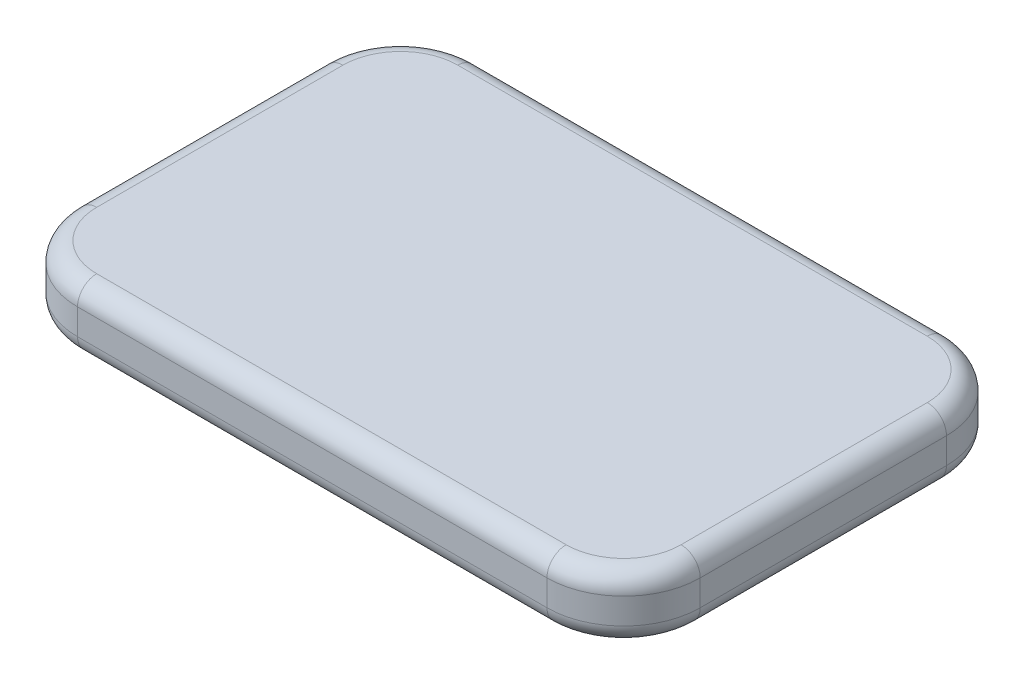
ISO-10303-21;
HEADER;
FILE_DESCRIPTION(('STEP AP214'),'2;1');
FILE_NAME('part.step','',(''),(''),'','','');
FILE_SCHEMA(('AUTOMOTIVE_DESIGN { 1 0 10303 214 1 1 1 1 }'));
ENDSEC;
DATA;
#1=APPLICATION_CONTEXT('core data for automotive mechanical design processes');
#2=APPLICATION_PROTOCOL_DEFINITION('international standard','automotive_design',2000,#1);
#3=PRODUCT_CONTEXT('',#1,'mechanical');
#4=PRODUCT('Part','Part','',(#3));
#5=PRODUCT_RELATED_PRODUCT_CATEGORY('part','',(#4));
#6=PRODUCT_DEFINITION_FORMATION('','',#4);
#7=PRODUCT_DEFINITION_CONTEXT('part definition',#1,'design');
#8=PRODUCT_DEFINITION('design','',#6,#7);
#9=PRODUCT_DEFINITION_SHAPE('','',#8);
#10=(LENGTH_UNIT() NAMED_UNIT(*) SI_UNIT(.MILLI.,.METRE.));
#11=(NAMED_UNIT(*) PLANE_ANGLE_UNIT() SI_UNIT($,.RADIAN.));
#12=(NAMED_UNIT(*) SI_UNIT($,.STERADIAN.) SOLID_ANGLE_UNIT());
#13=UNCERTAINTY_MEASURE_WITH_UNIT(LENGTH_MEASURE(1.E-05),#10,'distance_accuracy_value','');
#14=(GEOMETRIC_REPRESENTATION_CONTEXT(3) GLOBAL_UNCERTAINTY_ASSIGNED_CONTEXT((#13)) GLOBAL_UNIT_ASSIGNED_CONTEXT((#10,
#11,#12)) REPRESENTATION_CONTEXT('',''));
#15=CARTESIAN_POINT('',(0.,0.,0.));
#16=DIRECTION('',(0.,0.,1.));
#17=DIRECTION('',(1.,0.,0.));
#18=AXIS2_PLACEMENT_3D('',#15,#16,#17);
#19=CARTESIAN_POINT('',(0.,17.018,-105.918));
#20=DIRECTION('',(0.,0.,-1.));
#21=DIRECTION('',(-1.,0.,0.));
#22=AXIS2_PLACEMENT_3D('',#19,#20,#21);
#23=PLANE('',#22);
#24=DIRECTION('',(0.,-1.,0.));
#25=VECTOR('',#24,1.);
#26=CARTESIAN_POINT('',(144.78,0.,-105.918));
#27=LINE('',#26,#25);
#28=CARTESIAN_POINT('',(144.78,11.938,-105.918));
#29=VERTEX_POINT('',#28);
#30=CARTESIAN_POINT('',(144.78,5.08,-105.918));
#31=VERTEX_POINT('',#30);
#32=EDGE_CURVE('E345',#29,#31,#27,.T.);
#33=ORIENTED_EDGE('',*,*,#32,.T.);
#34=DIRECTION('',(1.,0.,0.));
#35=VECTOR('',#34,1.);
#36=CARTESIAN_POINT('',(20.32,5.08,-105.918));
#37=LINE('',#36,#35);
#38=CARTESIAN_POINT('',(20.32,5.08,-105.918));
#39=VERTEX_POINT('',#38);
#40=EDGE_CURVE('E64',#31,#39,#37,.F.);
#41=ORIENTED_EDGE('',*,*,#40,.T.);
#42=DIRECTION('',(0.,-1.,0.));
#43=VECTOR('',#42,1.);
#44=CARTESIAN_POINT('',(20.32,17.018,-105.918));
#45=LINE('',#44,#43);
#46=CARTESIAN_POINT('',(20.32,11.938,-105.918));
#47=VERTEX_POINT('',#46);
#48=EDGE_CURVE('E349',#39,#47,#45,.F.);
#49=ORIENTED_EDGE('',*,*,#48,.T.);
#50=DIRECTION('',(1.,0.,0.));
#51=VECTOR('',#50,1.);
#52=CARTESIAN_POINT('',(0.,11.938,-105.918));
#53=LINE('',#52,#51);
#54=EDGE_CURVE('E227',#47,#29,#53,.T.);
#55=ORIENTED_EDGE('',*,*,#54,.T.);
#56=EDGE_LOOP('',(#33,#41,#49,#55));
#57=FACE_BOUND('',#56,.T.);
#58=ADVANCED_FACE('F39',(#57),#23,.T.);
#59=CARTESIAN_POINT('',(0.,17.018,0.));
#60=DIRECTION('',(-1.,0.,0.));
#61=DIRECTION('',(0.,0.,1.));
#62=AXIS2_PLACEMENT_3D('',#59,#60,#61);
#63=PLANE('',#62);
#64=DIRECTION('',(0.,-1.,0.));
#65=VECTOR('',#64,1.);
#66=CARTESIAN_POINT('',(0.,17.018,-85.598));
#67=LINE('',#66,#65);
#68=CARTESIAN_POINT('',(0.,11.938,-85.598));
#69=VERTEX_POINT('',#68);
#70=CARTESIAN_POINT('',(0.,5.08,-85.598));
#71=VERTEX_POINT('',#70);
#72=EDGE_CURVE('E185',#69,#71,#67,.T.);
#73=ORIENTED_EDGE('',*,*,#72,.T.);
#74=DIRECTION('',(0.,0.,-1.));
#75=VECTOR('',#74,1.);
#76=CARTESIAN_POINT('',(0.,5.08,-20.32));
#77=LINE('',#76,#75);
#78=CARTESIAN_POINT('',(0.,5.08,-20.32));
#79=VERTEX_POINT('',#78);
#80=EDGE_CURVE('E11',#71,#79,#77,.F.);
#81=ORIENTED_EDGE('',*,*,#80,.T.);
#82=DIRECTION('',(0.,-1.,0.));
#83=VECTOR('',#82,1.);
#84=CARTESIAN_POINT('',(0.,17.018,-20.32));
#85=LINE('',#84,#83);
#86=CARTESIAN_POINT('',(0.,11.938,-20.32));
#87=VERTEX_POINT('',#86);
#88=EDGE_CURVE('E188',#79,#87,#85,.F.);
#89=ORIENTED_EDGE('',*,*,#88,.T.);
#90=DIRECTION('',(0.,0.,-1.));
#91=VECTOR('',#90,1.);
#92=CARTESIAN_POINT('',(0.,11.938,0.));
#93=LINE('',#92,#91);
#94=EDGE_CURVE('E232',#87,#69,#93,.T.);
#95=ORIENTED_EDGE('',*,*,#94,.T.);
#96=EDGE_LOOP('',(#73,#81,#89,#95));
#97=FACE_BOUND('',#96,.T.);
#98=ADVANCED_FACE('F415',(#97),#63,.T.);
#99=CARTESIAN_POINT('',(0.,17.018,0.));
#100=DIRECTION('',(0.,0.,-1.));
#101=DIRECTION('',(-1.,0.,0.));
#102=AXIS2_PLACEMENT_3D('',#99,#100,#101);
#103=PLANE('',#102);
#104=DIRECTION('',(0.,-1.,0.));
#105=VECTOR('',#104,1.);
#106=CARTESIAN_POINT('',(20.32,0.,0.));
#107=LINE('',#106,#105);
#108=CARTESIAN_POINT('',(20.32,11.938,0.));
#109=VERTEX_POINT('',#108);
#110=CARTESIAN_POINT('',(20.32,5.08,0.));
#111=VERTEX_POINT('',#110);
#112=EDGE_CURVE('E358',#109,#111,#107,.T.);
#113=ORIENTED_EDGE('',*,*,#112,.T.);
#114=DIRECTION('',(1.,0.,0.));
#115=VECTOR('',#114,1.);
#116=CARTESIAN_POINT('',(0.,5.08,0.));
#117=LINE('',#116,#115);
#118=CARTESIAN_POINT('',(144.78,5.08,0.));
#119=VERTEX_POINT('',#118);
#120=EDGE_CURVE('E287',#111,#119,#117,.T.);
#121=ORIENTED_EDGE('',*,*,#120,.T.);
#122=DIRECTION('',(0.,-1.,0.));
#123=VECTOR('',#122,1.);
#124=CARTESIAN_POINT('',(144.78,17.018,0.));
#125=LINE('',#124,#123);
#126=CARTESIAN_POINT('',(144.78,11.938,0.));
#127=VERTEX_POINT('',#126);
#128=EDGE_CURVE('E353',#119,#127,#125,.F.);
#129=ORIENTED_EDGE('',*,*,#128,.T.);
#130=DIRECTION('',(1.,0.,0.));
#131=VECTOR('',#130,1.);
#132=CARTESIAN_POINT('',(20.32,11.938,0.));
#133=LINE('',#132,#131);
#134=EDGE_CURVE('E213',#127,#109,#133,.F.);
#135=ORIENTED_EDGE('',*,*,#134,.T.);
#136=EDGE_LOOP('',(#113,#121,#129,#135));
#137=FACE_BOUND('',#136,.T.);
#138=ADVANCED_FACE('F435',(#137),#103,.F.);
#139=CARTESIAN_POINT('',(165.1,17.018,0.));
#140=DIRECTION('',(-1.,0.,0.));
#141=DIRECTION('',(0.,0.,1.));
#142=AXIS2_PLACEMENT_3D('',#139,#140,#141);
#143=PLANE('',#142);
#144=DIRECTION('',(0.,-1.,0.));
#145=VECTOR('',#144,1.);
#146=CARTESIAN_POINT('',(165.1,17.018,-20.32));
#147=LINE('',#146,#145);
#148=CARTESIAN_POINT('',(165.1,11.938,-20.32));
#149=VERTEX_POINT('',#148);
#150=CARTESIAN_POINT('',(165.1,5.08,-20.32));
#151=VERTEX_POINT('',#150);
#152=EDGE_CURVE('E362',#149,#151,#147,.T.);
#153=ORIENTED_EDGE('',*,*,#152,.T.);
#154=DIRECTION('',(0.,0.,-1.));
#155=VECTOR('',#154,1.);
#156=CARTESIAN_POINT('',(165.1,5.08,0.));
#157=LINE('',#156,#155);
#158=CARTESIAN_POINT('',(165.1,5.08,-85.598));
#159=VERTEX_POINT('',#158);
#160=EDGE_CURVE('E293',#151,#159,#157,.T.);
#161=ORIENTED_EDGE('',*,*,#160,.T.);
#162=DIRECTION('',(0.,-1.,0.));
#163=VECTOR('',#162,1.);
#164=CARTESIAN_POINT('',(165.1,17.018,-85.598));
#165=LINE('',#164,#163);
#166=CARTESIAN_POINT('',(165.1,11.938,-85.598));
#167=VERTEX_POINT('',#166);
#168=EDGE_CURVE('E258',#159,#167,#165,.F.);
#169=ORIENTED_EDGE('',*,*,#168,.T.);
#170=DIRECTION('',(0.,0.,-1.));
#171=VECTOR('',#170,1.);
#172=CARTESIAN_POINT('',(165.1,11.938,-20.32));
#173=LINE('',#172,#171);
#174=EDGE_CURVE('E220',#167,#149,#173,.F.);
#175=ORIENTED_EDGE('',*,*,#174,.T.);
#176=EDGE_LOOP('',(#153,#161,#169,#175));
#177=FACE_BOUND('',#176,.T.);
#178=ADVANCED_FACE('F368',(#177),#143,.F.);
#179=CARTESIAN_POINT('',(0.,17.018,0.));
#180=DIRECTION('',(0.,1.,0.));
#181=DIRECTION('',(0.,0.,1.));
#182=AXIS2_PLACEMENT_3D('',#179,#180,#181);
#183=PLANE('',#182);
#184=DIRECTION('',(0.,0.,-1.));
#185=VECTOR('',#184,1.);
#186=CARTESIAN_POINT('',(5.08,17.018,0.));
#187=LINE('',#186,#185);
#188=CARTESIAN_POINT('',(5.08,17.018,-85.598));
#189=VERTEX_POINT('',#188);
#190=CARTESIAN_POINT('',(5.08,17.018,-20.32));
#191=VERTEX_POINT('',#190);
#192=EDGE_CURVE('E159',#189,#191,#187,.F.);
#193=ORIENTED_EDGE('',*,*,#192,.T.);
#194=CARTESIAN_POINT('',(20.32,17.018,-20.32));
#195=DIRECTION('',(0.,1.,0.));
#196=DIRECTION('',(0.,0.,1.));
#197=AXIS2_PLACEMENT_3D('',#194,#195,#196);
#198=CIRCLE('',#197,15.24);
#199=CARTESIAN_POINT('',(20.32,17.018,-5.08));
#200=VERTEX_POINT('',#199);
#201=EDGE_CURVE('E206',#191,#200,#198,.T.);
#202=ORIENTED_EDGE('',*,*,#201,.T.);
#203=DIRECTION('',(1.,0.,0.));
#204=VECTOR('',#203,1.);
#205=CARTESIAN_POINT('',(144.78,17.018,-5.08));
#206=LINE('',#205,#204);
#207=CARTESIAN_POINT('',(144.78,17.018,-5.08));
#208=VERTEX_POINT('',#207);
#209=EDGE_CURVE('E203',#200,#208,#206,.T.);
#210=ORIENTED_EDGE('',*,*,#209,.T.);
#211=CARTESIAN_POINT('',(144.78,17.018,-20.32));
#212=DIRECTION('',(0.,1.,0.));
#213=DIRECTION('',(0.,0.,1.));
#214=AXIS2_PLACEMENT_3D('',#211,#212,#213);
#215=CIRCLE('',#214,15.24);
#216=CARTESIAN_POINT('',(160.02,17.018,-20.32));
#217=VERTEX_POINT('',#216);
#218=EDGE_CURVE('E200',#208,#217,#215,.T.);
#219=ORIENTED_EDGE('',*,*,#218,.T.);
#220=DIRECTION('',(0.,0.,-1.));
#221=VECTOR('',#220,1.);
#222=CARTESIAN_POINT('',(160.02,17.018,-85.598));
#223=LINE('',#222,#221);
#224=CARTESIAN_POINT('',(160.02,17.018,-85.598));
#225=VERTEX_POINT('',#224);
#226=EDGE_CURVE('E197',#217,#225,#223,.T.);
#227=ORIENTED_EDGE('',*,*,#226,.T.);
#228=CARTESIAN_POINT('',(144.78,17.018,-85.598));
#229=DIRECTION('',(0.,1.,0.));
#230=DIRECTION('',(0.,0.,1.));
#231=AXIS2_PLACEMENT_3D('',#228,#229,#230);
#232=CIRCLE('',#231,15.24);
#233=CARTESIAN_POINT('',(144.78,17.018,-100.838));
#234=VERTEX_POINT('',#233);
#235=EDGE_CURVE('E194',#225,#234,#232,.T.);
#236=ORIENTED_EDGE('',*,*,#235,.T.);
#237=DIRECTION('',(1.,0.,0.));
#238=VECTOR('',#237,1.);
#239=CARTESIAN_POINT('',(0.,17.018,-100.838));
#240=LINE('',#239,#238);
#241=CARTESIAN_POINT('',(20.32,17.018,-100.838));
#242=VERTEX_POINT('',#241);
#243=EDGE_CURVE('E162',#234,#242,#240,.F.);
#244=ORIENTED_EDGE('',*,*,#243,.T.);
#245=CARTESIAN_POINT('',(20.32,17.018,-85.598));
#246=DIRECTION('',(0.,1.,0.));
#247=DIRECTION('',(0.,0.,1.));
#248=AXIS2_PLACEMENT_3D('',#245,#246,#247);
#249=CIRCLE('',#248,15.24);
#250=EDGE_CURVE('E154',#242,#189,#249,.T.);
#251=ORIENTED_EDGE('',*,*,#250,.T.);
#252=EDGE_LOOP('',(#193,#202,#210,#219,#227,#236,#244,#251));
#253=FACE_BOUND('',#252,.T.);
#254=ADVANCED_FACE('F156',(#253),#183,.T.);
#255=CARTESIAN_POINT('',(0.,0.,0.));
#256=DIRECTION('',(0.,1.,0.));
#257=DIRECTION('',(0.,0.,1.));
#258=AXIS2_PLACEMENT_3D('',#255,#256,#257);
#259=PLANE('',#258);
#260=DIRECTION('',(1.,0.,0.));
#261=VECTOR('',#260,1.);
#262=CARTESIAN_POINT('',(0.,0.,-5.08));
#263=LINE('',#262,#261);
#264=CARTESIAN_POINT('',(144.78,0.,-5.08));
#265=VERTEX_POINT('',#264);
#266=CARTESIAN_POINT('',(20.32,0.,-5.08));
#267=VERTEX_POINT('',#266);
#268=EDGE_CURVE('E276',#265,#267,#263,.F.);
#269=ORIENTED_EDGE('',*,*,#268,.T.);
#270=CARTESIAN_POINT('',(20.32,0.,-20.32));
#271=DIRECTION('',(0.,1.,0.));
#272=DIRECTION('',(0.,0.,1.));
#273=AXIS2_PLACEMENT_3D('',#270,#271,#272);
#274=CIRCLE('',#273,15.24);
#275=CARTESIAN_POINT('',(5.08,0.,-20.32));
#276=VERTEX_POINT('',#275);
#277=EDGE_CURVE('E279',#267,#276,#274,.F.);
#278=ORIENTED_EDGE('',*,*,#277,.T.);
#279=DIRECTION('',(0.,0.,-1.));
#280=VECTOR('',#279,1.);
#281=CARTESIAN_POINT('',(5.08,0.,-85.598));
#282=LINE('',#281,#280);
#283=CARTESIAN_POINT('',(5.08,0.,-85.598));
#284=VERTEX_POINT('',#283);
#285=EDGE_CURVE('E235',#276,#284,#282,.T.);
#286=ORIENTED_EDGE('',*,*,#285,.T.);
#287=CARTESIAN_POINT('',(20.32,0.,-85.598));
#288=DIRECTION('',(0.,1.,0.));
#289=DIRECTION('',(0.,0.,1.));
#290=AXIS2_PLACEMENT_3D('',#287,#288,#289);
#291=CIRCLE('',#290,15.24);
#292=CARTESIAN_POINT('',(20.32,0.,-100.838));
#293=VERTEX_POINT('',#292);
#294=EDGE_CURVE('E261',#284,#293,#291,.F.);
#295=ORIENTED_EDGE('',*,*,#294,.T.);
#296=DIRECTION('',(1.,0.,0.));
#297=VECTOR('',#296,1.);
#298=CARTESIAN_POINT('',(144.78,0.,-100.838));
#299=LINE('',#298,#297);
#300=CARTESIAN_POINT('',(144.78,0.,-100.838));
#301=VERTEX_POINT('',#300);
#302=EDGE_CURVE('E264',#293,#301,#299,.T.);
#303=ORIENTED_EDGE('',*,*,#302,.T.);
#304=CARTESIAN_POINT('',(144.78,0.,-85.598));
#305=DIRECTION('',(0.,1.,0.));
#306=DIRECTION('',(0.,0.,1.));
#307=AXIS2_PLACEMENT_3D('',#304,#305,#306);
#308=CIRCLE('',#307,15.24);
#309=CARTESIAN_POINT('',(160.02,0.,-85.598));
#310=VERTEX_POINT('',#309);
#311=EDGE_CURVE('E267',#301,#310,#308,.F.);
#312=ORIENTED_EDGE('',*,*,#311,.T.);
#313=DIRECTION('',(0.,0.,-1.));
#314=VECTOR('',#313,1.);
#315=CARTESIAN_POINT('',(160.02,0.,0.));
#316=LINE('',#315,#314);
#317=CARTESIAN_POINT('',(160.02,0.,-20.32));
#318=VERTEX_POINT('',#317);
#319=EDGE_CURVE('E270',#310,#318,#316,.F.);
#320=ORIENTED_EDGE('',*,*,#319,.T.);
#321=CARTESIAN_POINT('',(144.78,0.,-20.32));
#322=DIRECTION('',(0.,1.,0.));
#323=DIRECTION('',(0.,0.,1.));
#324=AXIS2_PLACEMENT_3D('',#321,#322,#323);
#325=CIRCLE('',#324,15.24);
#326=EDGE_CURVE('E273',#318,#265,#325,.F.);
#327=ORIENTED_EDGE('',*,*,#326,.T.);
#328=EDGE_LOOP('',(#269,#278,#286,#295,#303,#312,#320,#327));
#329=FACE_BOUND('',#328,.T.);
#330=ADVANCED_FACE('F401',(#329),#259,.F.);
#331=CARTESIAN_POINT('',(144.78,17.018,-20.32));
#332=DIRECTION('',(0.,-1.,0.));
#333=DIRECTION('',(0.,0.,-1.));
#334=AXIS2_PLACEMENT_3D('',#331,#332,#333);
#335=CYLINDRICAL_SURFACE('',#334,20.32);
#336=ORIENTED_EDGE('',*,*,#128,.F.);
#337=CARTESIAN_POINT('',(144.78,5.08,-20.32));
#338=DIRECTION('',(0.,1.,0.));
#339=DIRECTION('',(0.,0.,1.));
#340=AXIS2_PLACEMENT_3D('',#337,#338,#339);
#341=CIRCLE('',#340,20.32);
#342=EDGE_CURVE('E290',#119,#151,#341,.T.);
#343=ORIENTED_EDGE('',*,*,#342,.T.);
#344=ORIENTED_EDGE('',*,*,#152,.F.);
#345=CARTESIAN_POINT('',(144.78,11.938,-20.32));
#346=DIRECTION('',(0.,1.,0.));
#347=DIRECTION('',(0.,0.,1.));
#348=AXIS2_PLACEMENT_3D('',#345,#346,#347);
#349=CIRCLE('',#348,20.32);
#350=EDGE_CURVE('E216',#149,#127,#349,.F.);
#351=ORIENTED_EDGE('',*,*,#350,.T.);
#352=EDGE_LOOP('',(#336,#343,#344,#351));
#353=FACE_BOUND('',#352,.T.);
#354=ADVANCED_FACE('F388',(#353),#335,.T.);
#355=CARTESIAN_POINT('',(144.78,17.018,-85.598));
#356=DIRECTION('',(0.,1.,0.));
#357=DIRECTION('',(0.,0.,1.));
#358=AXIS2_PLACEMENT_3D('',#355,#356,#357);
#359=CYLINDRICAL_SURFACE('',#358,20.32);
#360=ORIENTED_EDGE('',*,*,#168,.F.);
#361=CARTESIAN_POINT('',(144.78,5.08,-85.598));
#362=DIRECTION('',(0.,1.,0.));
#363=DIRECTION('',(0.,0.,1.));
#364=AXIS2_PLACEMENT_3D('',#361,#362,#363);
#365=CIRCLE('',#364,20.32);
#366=EDGE_CURVE('E296',#159,#31,#365,.T.);
#367=ORIENTED_EDGE('',*,*,#366,.T.);
#368=ORIENTED_EDGE('',*,*,#32,.F.);
#369=CARTESIAN_POINT('',(144.78,11.938,-85.598));
#370=DIRECTION('',(0.,1.,0.));
#371=DIRECTION('',(0.,0.,1.));
#372=AXIS2_PLACEMENT_3D('',#369,#370,#371);
#373=CIRCLE('',#372,20.32);
#374=EDGE_CURVE('E223',#29,#167,#373,.F.);
#375=ORIENTED_EDGE('',*,*,#374,.T.);
#376=EDGE_LOOP('',(#360,#367,#368,#375));
#377=FACE_BOUND('',#376,.T.);
#378=ADVANCED_FACE('F344',(#377),#359,.T.);
#379=CARTESIAN_POINT('',(20.32,17.018,-85.598));
#380=DIRECTION('',(0.,-1.,0.));
#381=DIRECTION('',(0.,0.,-1.));
#382=AXIS2_PLACEMENT_3D('',#379,#380,#381);
#383=CYLINDRICAL_SURFACE('',#382,20.32);
#384=ORIENTED_EDGE('',*,*,#48,.F.);
#385=CARTESIAN_POINT('',(20.32,5.08,-85.598));
#386=DIRECTION('',(0.,1.,0.));
#387=DIRECTION('',(0.,0.,1.));
#388=AXIS2_PLACEMENT_3D('',#385,#386,#387);
#389=CIRCLE('',#388,20.32);
#390=EDGE_CURVE('E49',#39,#71,#389,.T.);
#391=ORIENTED_EDGE('',*,*,#390,.T.);
#392=ORIENTED_EDGE('',*,*,#72,.F.);
#393=CARTESIAN_POINT('',(20.32,11.938,-85.598));
#394=DIRECTION('',(0.,1.,0.));
#395=DIRECTION('',(0.,0.,1.));
#396=AXIS2_PLACEMENT_3D('',#393,#394,#395);
#397=CIRCLE('',#396,20.32);
#398=EDGE_CURVE('E173',#69,#47,#397,.F.);
#399=ORIENTED_EDGE('',*,*,#398,.T.);
#400=EDGE_LOOP('',(#384,#391,#392,#399));
#401=FACE_BOUND('',#400,.T.);
#402=ADVANCED_FACE('F444',(#401),#383,.T.);
#403=CARTESIAN_POINT('',(20.32,17.018,-20.32));
#404=DIRECTION('',(0.,1.,0.));
#405=DIRECTION('',(0.,0.,1.));
#406=AXIS2_PLACEMENT_3D('',#403,#404,#405);
#407=CYLINDRICAL_SURFACE('',#406,20.32);
#408=ORIENTED_EDGE('',*,*,#88,.F.);
#409=CARTESIAN_POINT('',(20.32,5.08,-20.32));
#410=DIRECTION('',(0.,1.,0.));
#411=DIRECTION('',(0.,0.,1.));
#412=AXIS2_PLACEMENT_3D('',#409,#410,#411);
#413=CIRCLE('',#412,20.32);
#414=EDGE_CURVE('E283',#79,#111,#413,.T.);
#415=ORIENTED_EDGE('',*,*,#414,.T.);
#416=ORIENTED_EDGE('',*,*,#112,.F.);
#417=CARTESIAN_POINT('',(20.32,11.938,-20.32));
#418=DIRECTION('',(0.,1.,0.));
#419=DIRECTION('',(0.,0.,1.));
#420=AXIS2_PLACEMENT_3D('',#417,#418,#419);
#421=CIRCLE('',#420,20.32);
#422=EDGE_CURVE('E209',#109,#87,#421,.F.);
#423=ORIENTED_EDGE('',*,*,#422,.T.);
#424=EDGE_LOOP('',(#408,#415,#416,#423));
#425=FACE_BOUND('',#424,.T.);
#426=ADVANCED_FACE('F418',(#425),#407,.T.);
#427=CARTESIAN_POINT('',(144.78,11.938,-85.598));
#428=DIRECTION('',(0.,1.,0.));
#429=DIRECTION('',(0.,0.,1.));
#430=AXIS2_PLACEMENT_3D('',#427,#428,#429);
#431=TOROIDAL_SURFACE('',#430,15.24,5.08);
#432=CARTESIAN_POINT('',(160.02,11.938,-85.598));
#433=DIRECTION('',(0.,0.,1.));
#434=DIRECTION('',(1.,0.,0.));
#435=AXIS2_PLACEMENT_3D('',#432,#433,#434);
#436=CIRCLE('',#435,5.08);
#437=EDGE_CURVE('E250',#167,#225,#436,.T.);
#438=ORIENTED_EDGE('',*,*,#437,.F.);
#439=ORIENTED_EDGE('',*,*,#374,.F.);
#440=CARTESIAN_POINT('',(144.78,11.938,-100.838));
#441=DIRECTION('',(-1.,0.,0.));
#442=DIRECTION('',(0.,0.,1.));
#443=AXIS2_PLACEMENT_3D('',#440,#441,#442);
#444=CIRCLE('',#443,5.08);
#445=EDGE_CURVE('E254',#234,#29,#444,.T.);
#446=ORIENTED_EDGE('',*,*,#445,.F.);
#447=ORIENTED_EDGE('',*,*,#235,.F.);
#448=EDGE_LOOP('',(#438,#439,#446,#447));
#449=FACE_BOUND('',#448,.T.);
#450=ADVANCED_FACE('F375',(#449),#431,.T.);
#451=CARTESIAN_POINT('',(0.,11.938,-100.838));
#452=DIRECTION('',(1.,0.,0.));
#453=DIRECTION('',(0.,0.,-1.));
#454=AXIS2_PLACEMENT_3D('',#451,#452,#453);
#455=CYLINDRICAL_SURFACE('',#454,5.08);
#456=ORIENTED_EDGE('',*,*,#445,.T.);
#457=ORIENTED_EDGE('',*,*,#54,.F.);
#458=CARTESIAN_POINT('',(20.32,11.938,-100.838));
#459=DIRECTION('',(-1.,0.,0.));
#460=DIRECTION('',(0.,0.,1.));
#461=AXIS2_PLACEMENT_3D('',#458,#459,#460);
#462=CIRCLE('',#461,5.08);
#463=EDGE_CURVE('E247',#242,#47,#462,.T.);
#464=ORIENTED_EDGE('',*,*,#463,.F.);
#465=ORIENTED_EDGE('',*,*,#243,.F.);
#466=EDGE_LOOP('',(#456,#457,#464,#465));
#467=FACE_BOUND('',#466,.T.);
#468=ADVANCED_FACE('F465',(#467),#455,.T.);
#469=CARTESIAN_POINT('',(160.02,11.938,0.));
#470=DIRECTION('',(0.,0.,1.));
#471=DIRECTION('',(1.,0.,0.));
#472=AXIS2_PLACEMENT_3D('',#469,#470,#471);
#473=CYLINDRICAL_SURFACE('',#472,5.08);
#474=ORIENTED_EDGE('',*,*,#437,.T.);
#475=ORIENTED_EDGE('',*,*,#226,.F.);
#476=CARTESIAN_POINT('',(160.02,11.938,-20.32));
#477=DIRECTION('',(0.,0.,1.));
#478=DIRECTION('',(1.,0.,0.));
#479=AXIS2_PLACEMENT_3D('',#476,#477,#478);
#480=CIRCLE('',#479,5.08);
#481=EDGE_CURVE('E177',#149,#217,#480,.T.);
#482=ORIENTED_EDGE('',*,*,#481,.F.);
#483=ORIENTED_EDGE('',*,*,#174,.F.);
#484=EDGE_LOOP('',(#474,#475,#482,#483));
#485=FACE_BOUND('',#484,.T.);
#486=ADVANCED_FACE('F379',(#485),#473,.T.);
#487=CARTESIAN_POINT('',(20.32,11.938,-85.598));
#488=DIRECTION('',(0.,1.,0.));
#489=DIRECTION('',(0.,0.,1.));
#490=AXIS2_PLACEMENT_3D('',#487,#488,#489);
#491=TOROIDAL_SURFACE('',#490,15.24,5.08);
#492=ORIENTED_EDGE('',*,*,#463,.T.);
#493=ORIENTED_EDGE('',*,*,#398,.F.);
#494=CARTESIAN_POINT('',(5.08,11.938,-85.598));
#495=DIRECTION('',(0.,0.,1.));
#496=DIRECTION('',(1.,0.,0.));
#497=AXIS2_PLACEMENT_3D('',#494,#495,#496);
#498=CIRCLE('',#497,5.08);
#499=EDGE_CURVE('E170',#189,#69,#498,.T.);
#500=ORIENTED_EDGE('',*,*,#499,.F.);
#501=ORIENTED_EDGE('',*,*,#250,.F.);
#502=EDGE_LOOP('',(#492,#493,#500,#501));
#503=FACE_BOUND('',#502,.T.);
#504=ADVANCED_FACE('F171',(#503),#491,.T.);
#505=CARTESIAN_POINT('',(144.78,11.938,-20.32));
#506=DIRECTION('',(0.,1.,0.));
#507=DIRECTION('',(0.,0.,1.));
#508=AXIS2_PLACEMENT_3D('',#505,#506,#507);
#509=TOROIDAL_SURFACE('',#508,15.24,5.08);
#510=ORIENTED_EDGE('',*,*,#481,.T.);
#511=ORIENTED_EDGE('',*,*,#218,.F.);
#512=CARTESIAN_POINT('',(144.78,11.938,-5.08));
#513=DIRECTION('',(-1.,0.,0.));
#514=DIRECTION('',(0.,0.,1.));
#515=AXIS2_PLACEMENT_3D('',#512,#513,#514);
#516=CIRCLE('',#515,5.08);
#517=EDGE_CURVE('E178',#127,#208,#516,.T.);
#518=ORIENTED_EDGE('',*,*,#517,.F.);
#519=ORIENTED_EDGE('',*,*,#350,.F.);
#520=EDGE_LOOP('',(#510,#511,#518,#519));
#521=FACE_BOUND('',#520,.T.);
#522=ADVANCED_FACE('F384',(#521),#509,.T.);
#523=CARTESIAN_POINT('',(5.08,11.938,0.));
#524=DIRECTION('',(0.,0.,-1.));
#525=DIRECTION('',(-1.,0.,0.));
#526=AXIS2_PLACEMENT_3D('',#523,#524,#525);
#527=CYLINDRICAL_SURFACE('',#526,5.08);
#528=ORIENTED_EDGE('',*,*,#499,.T.);
#529=ORIENTED_EDGE('',*,*,#94,.F.);
#530=CARTESIAN_POINT('',(5.08,11.938,-20.32));
#531=DIRECTION('',(0.,0.,1.));
#532=DIRECTION('',(1.,0.,0.));
#533=AXIS2_PLACEMENT_3D('',#530,#531,#532);
#534=CIRCLE('',#533,5.08);
#535=EDGE_CURVE('E182',#191,#87,#534,.T.);
#536=ORIENTED_EDGE('',*,*,#535,.F.);
#537=ORIENTED_EDGE('',*,*,#192,.F.);
#538=EDGE_LOOP('',(#528,#529,#536,#537));
#539=FACE_BOUND('',#538,.T.);
#540=ADVANCED_FACE('F180',(#539),#527,.T.);
#541=CARTESIAN_POINT('',(0.,11.938,-5.08));
#542=DIRECTION('',(-1.,0.,0.));
#543=DIRECTION('',(0.,0.,1.));
#544=AXIS2_PLACEMENT_3D('',#541,#542,#543);
#545=CYLINDRICAL_SURFACE('',#544,5.08);
#546=ORIENTED_EDGE('',*,*,#517,.T.);
#547=ORIENTED_EDGE('',*,*,#209,.F.);
#548=CARTESIAN_POINT('',(20.32,11.938,-5.08));
#549=DIRECTION('',(-1.,0.,0.));
#550=DIRECTION('',(0.,0.,1.));
#551=AXIS2_PLACEMENT_3D('',#548,#549,#550);
#552=CIRCLE('',#551,5.08);
#553=EDGE_CURVE('E236',#109,#200,#552,.T.);
#554=ORIENTED_EDGE('',*,*,#553,.F.);
#555=ORIENTED_EDGE('',*,*,#134,.F.);
#556=EDGE_LOOP('',(#546,#547,#554,#555));
#557=FACE_BOUND('',#556,.T.);
#558=ADVANCED_FACE('F452',(#557),#545,.T.);
#559=CARTESIAN_POINT('',(20.32,11.938,-20.32));
#560=DIRECTION('',(0.,1.,0.));
#561=DIRECTION('',(0.,0.,1.));
#562=AXIS2_PLACEMENT_3D('',#559,#560,#561);
#563=TOROIDAL_SURFACE('',#562,15.24,5.08);
#564=ORIENTED_EDGE('',*,*,#535,.T.);
#565=ORIENTED_EDGE('',*,*,#422,.F.);
#566=ORIENTED_EDGE('',*,*,#553,.T.);
#567=ORIENTED_EDGE('',*,*,#201,.F.);
#568=EDGE_LOOP('',(#564,#565,#566,#567));
#569=FACE_BOUND('',#568,.T.);
#570=ADVANCED_FACE('F449',(#569),#563,.T.);
#571=CARTESIAN_POINT('',(144.78,5.08,-85.598));
#572=DIRECTION('',(0.,1.,0.));
#573=DIRECTION('',(0.,0.,1.));
#574=AXIS2_PLACEMENT_3D('',#571,#572,#573);
#575=TOROIDAL_SURFACE('',#574,15.24,5.08);
#576=CARTESIAN_POINT('',(144.78,5.08,-100.838));
#577=DIRECTION('',(-1.,0.,0.));
#578=DIRECTION('',(0.,0.,1.));
#579=AXIS2_PLACEMENT_3D('',#576,#577,#578);
#580=CIRCLE('',#579,5.08);
#581=EDGE_CURVE('E324',#31,#301,#580,.T.);
#582=ORIENTED_EDGE('',*,*,#581,.F.);
#583=ORIENTED_EDGE('',*,*,#366,.F.);
#584=CARTESIAN_POINT('',(160.02,5.08,-85.598));
#585=DIRECTION('',(0.,0.,1.));
#586=DIRECTION('',(1.,0.,0.));
#587=AXIS2_PLACEMENT_3D('',#584,#585,#586);
#588=CIRCLE('',#587,5.08);
#589=EDGE_CURVE('E43',#310,#159,#588,.T.);
#590=ORIENTED_EDGE('',*,*,#589,.F.);
#591=ORIENTED_EDGE('',*,*,#311,.F.);
#592=EDGE_LOOP('',(#582,#583,#590,#591));
#593=FACE_BOUND('',#592,.T.);
#594=ADVANCED_FACE('F41',(#593),#575,.T.);
#595=CARTESIAN_POINT('',(160.02,5.08,0.));
#596=DIRECTION('',(0.,0.,-1.));
#597=DIRECTION('',(-1.,0.,0.));
#598=AXIS2_PLACEMENT_3D('',#595,#596,#597);
#599=CYLINDRICAL_SURFACE('',#598,5.08);
#600=ORIENTED_EDGE('',*,*,#589,.T.);
#601=ORIENTED_EDGE('',*,*,#160,.F.);
#602=CARTESIAN_POINT('',(160.02,5.08,-20.32));
#603=DIRECTION('',(0.,0.,1.));
#604=DIRECTION('',(1.,0.,0.));
#605=AXIS2_PLACEMENT_3D('',#602,#603,#604);
#606=CIRCLE('',#605,5.08);
#607=EDGE_CURVE('E321',#318,#151,#606,.T.);
#608=ORIENTED_EDGE('',*,*,#607,.F.);
#609=ORIENTED_EDGE('',*,*,#319,.F.);
#610=EDGE_LOOP('',(#600,#601,#608,#609));
#611=FACE_BOUND('',#610,.T.);
#612=ADVANCED_FACE('F336',(#611),#599,.T.);
#613=CARTESIAN_POINT('',(0.,5.08,-100.838));
#614=DIRECTION('',(-1.,0.,0.));
#615=DIRECTION('',(0.,0.,1.));
#616=AXIS2_PLACEMENT_3D('',#613,#614,#615);
#617=CYLINDRICAL_SURFACE('',#616,5.08);
#618=ORIENTED_EDGE('',*,*,#581,.T.);
#619=ORIENTED_EDGE('',*,*,#302,.F.);
#620=CARTESIAN_POINT('',(20.32,5.08,-100.838));
#621=DIRECTION('',(-1.,0.,0.));
#622=DIRECTION('',(0.,0.,1.));
#623=AXIS2_PLACEMENT_3D('',#620,#621,#622);
#624=CIRCLE('',#623,5.08);
#625=EDGE_CURVE('E317',#39,#293,#624,.T.);
#626=ORIENTED_EDGE('',*,*,#625,.F.);
#627=ORIENTED_EDGE('',*,*,#40,.F.);
#628=EDGE_LOOP('',(#618,#619,#626,#627));
#629=FACE_BOUND('',#628,.T.);
#630=ADVANCED_FACE('F404',(#629),#617,.T.);
#631=CARTESIAN_POINT('',(144.78,5.08,-20.32));
#632=DIRECTION('',(0.,1.,0.));
#633=DIRECTION('',(0.,0.,1.));
#634=AXIS2_PLACEMENT_3D('',#631,#632,#633);
#635=TOROIDAL_SURFACE('',#634,15.24,5.08);
#636=ORIENTED_EDGE('',*,*,#607,.T.);
#637=ORIENTED_EDGE('',*,*,#342,.F.);
#638=CARTESIAN_POINT('',(144.78,5.08,-5.08));
#639=DIRECTION('',(-1.,0.,0.));
#640=DIRECTION('',(0.,0.,1.));
#641=AXIS2_PLACEMENT_3D('',#638,#639,#640);
#642=CIRCLE('',#641,5.08);
#643=EDGE_CURVE('E313',#265,#119,#642,.T.);
#644=ORIENTED_EDGE('',*,*,#643,.F.);
#645=ORIENTED_EDGE('',*,*,#326,.F.);
#646=EDGE_LOOP('',(#636,#637,#644,#645));
#647=FACE_BOUND('',#646,.T.);
#648=ADVANCED_FACE('F392',(#647),#635,.T.);
#649=CARTESIAN_POINT('',(20.32,5.08,-85.598));
#650=DIRECTION('',(0.,1.,0.));
#651=DIRECTION('',(0.,0.,1.));
#652=AXIS2_PLACEMENT_3D('',#649,#650,#651);
#653=TOROIDAL_SURFACE('',#652,15.24,5.08);
#654=ORIENTED_EDGE('',*,*,#625,.T.);
#655=ORIENTED_EDGE('',*,*,#294,.F.);
#656=CARTESIAN_POINT('',(5.08,5.08,-85.598));
#657=DIRECTION('',(0.,0.,1.));
#658=DIRECTION('',(1.,0.,0.));
#659=AXIS2_PLACEMENT_3D('',#656,#657,#658);
#660=CIRCLE('',#659,5.08);
#661=EDGE_CURVE('E309',#71,#284,#660,.T.);
#662=ORIENTED_EDGE('',*,*,#661,.F.);
#663=ORIENTED_EDGE('',*,*,#390,.F.);
#664=EDGE_LOOP('',(#654,#655,#662,#663));
#665=FACE_BOUND('',#664,.T.);
#666=ADVANCED_FACE('F406',(#665),#653,.T.);
#667=CARTESIAN_POINT('',(0.,5.08,-5.08));
#668=DIRECTION('',(1.,0.,0.));
#669=DIRECTION('',(0.,0.,-1.));
#670=AXIS2_PLACEMENT_3D('',#667,#668,#669);
#671=CYLINDRICAL_SURFACE('',#670,5.08);
#672=ORIENTED_EDGE('',*,*,#643,.T.);
#673=ORIENTED_EDGE('',*,*,#120,.F.);
#674=CARTESIAN_POINT('',(20.32,5.08,-5.08));
#675=DIRECTION('',(-1.,0.,0.));
#676=DIRECTION('',(0.,0.,1.));
#677=AXIS2_PLACEMENT_3D('',#674,#675,#676);
#678=CIRCLE('',#677,5.08);
#679=EDGE_CURVE('E306',#267,#111,#678,.T.);
#680=ORIENTED_EDGE('',*,*,#679,.F.);
#681=ORIENTED_EDGE('',*,*,#268,.F.);
#682=EDGE_LOOP('',(#672,#673,#680,#681));
#683=FACE_BOUND('',#682,.T.);
#684=ADVANCED_FACE('F397',(#683),#671,.T.);
#685=CARTESIAN_POINT('',(5.08,5.08,0.));
#686=DIRECTION('',(0.,0.,1.));
#687=DIRECTION('',(1.,0.,0.));
#688=AXIS2_PLACEMENT_3D('',#685,#686,#687);
#689=CYLINDRICAL_SURFACE('',#688,5.08);
#690=ORIENTED_EDGE('',*,*,#661,.T.);
#691=ORIENTED_EDGE('',*,*,#285,.F.);
#692=CARTESIAN_POINT('',(5.08,5.08,-20.32));
#693=DIRECTION('',(0.,0.,1.));
#694=DIRECTION('',(1.,0.,0.));
#695=AXIS2_PLACEMENT_3D('',#692,#693,#694);
#696=CIRCLE('',#695,5.08);
#697=EDGE_CURVE('E303',#79,#276,#696,.T.);
#698=ORIENTED_EDGE('',*,*,#697,.F.);
#699=ORIENTED_EDGE('',*,*,#80,.F.);
#700=EDGE_LOOP('',(#690,#691,#698,#699));
#701=FACE_BOUND('',#700,.T.);
#702=ADVANCED_FACE('F412',(#701),#689,.T.);
#703=CARTESIAN_POINT('',(20.32,5.08,-20.32));
#704=DIRECTION('',(0.,1.,0.));
#705=DIRECTION('',(0.,0.,1.));
#706=AXIS2_PLACEMENT_3D('',#703,#704,#705);
#707=TOROIDAL_SURFACE('',#706,15.24,5.08);
#708=ORIENTED_EDGE('',*,*,#679,.T.);
#709=ORIENTED_EDGE('',*,*,#414,.F.);
#710=ORIENTED_EDGE('',*,*,#697,.T.);
#711=ORIENTED_EDGE('',*,*,#277,.F.);
#712=EDGE_LOOP('',(#708,#709,#710,#711));
#713=FACE_BOUND('',#712,.T.);
#714=ADVANCED_FACE('F422',(#713),#707,.T.);
#715=CLOSED_SHELL('',(#58,#98,#138,#178,#254,#330,#354,#378,#402,#426,#450,#468,#486,#504,#522,
#540,#558,#570,#594,#612,#630,#648,#666,#684,#702,#714));
#716=MANIFOLD_SOLID_BREP('B2',#715);
#717=ADVANCED_BREP_SHAPE_REPRESENTATION('',(#18,#716),#14);
#718=SHAPE_DEFINITION_REPRESENTATION(#9,#717);
ENDSEC;
END-ISO-10303-21;
